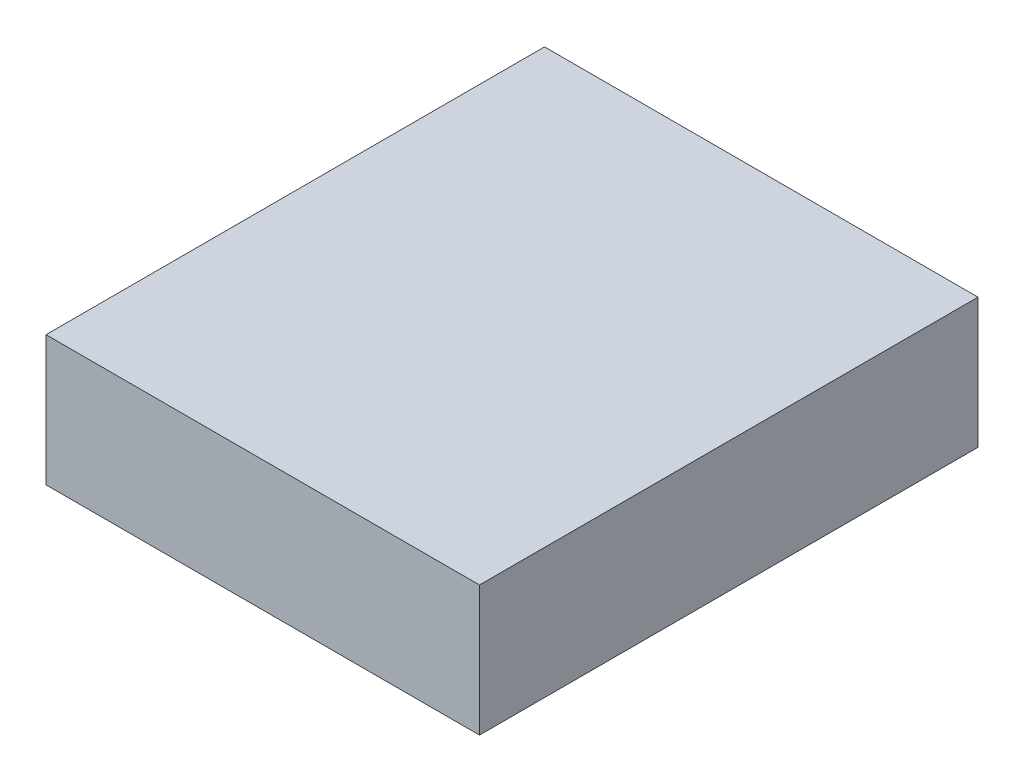
ISO-10303-21;
HEADER;
FILE_DESCRIPTION(('STEP AP214'),'2;1');
FILE_NAME('part.step','',(''),(''),'','','');
FILE_SCHEMA(('AUTOMOTIVE_DESIGN { 1 0 10303 214 1 1 1 1 }'));
ENDSEC;
DATA;
#1=APPLICATION_CONTEXT('core data for automotive mechanical design processes');
#2=APPLICATION_PROTOCOL_DEFINITION('international standard','automotive_design',2000,#1);
#3=PRODUCT_CONTEXT('',#1,'mechanical');
#4=PRODUCT('Part','Part','',(#3));
#5=PRODUCT_RELATED_PRODUCT_CATEGORY('part','',(#4));
#6=PRODUCT_DEFINITION_FORMATION('','',#4);
#7=PRODUCT_DEFINITION_CONTEXT('part definition',#1,'design');
#8=PRODUCT_DEFINITION('design','',#6,#7);
#9=PRODUCT_DEFINITION_SHAPE('','',#8);
#10=(LENGTH_UNIT() NAMED_UNIT(*) SI_UNIT(.MILLI.,.METRE.));
#11=(NAMED_UNIT(*) PLANE_ANGLE_UNIT() SI_UNIT($,.RADIAN.));
#12=(NAMED_UNIT(*) SI_UNIT($,.STERADIAN.) SOLID_ANGLE_UNIT());
#13=UNCERTAINTY_MEASURE_WITH_UNIT(LENGTH_MEASURE(1.E-05),#10,'distance_accuracy_value','');
#14=(GEOMETRIC_REPRESENTATION_CONTEXT(3) GLOBAL_UNCERTAINTY_ASSIGNED_CONTEXT((#13)) GLOBAL_UNIT_ASSIGNED_CONTEXT((#10,
#11,#12)) REPRESENTATION_CONTEXT('',''));
#15=CARTESIAN_POINT('',(0.,0.,0.));
#16=DIRECTION('',(0.,0.,1.));
#17=DIRECTION('',(1.,0.,0.));
#18=AXIS2_PLACEMENT_3D('',#15,#16,#17);
#19=CARTESIAN_POINT('',(-63.5,38.1,73.025));
#20=DIRECTION('',(1.,0.,0.));
#21=DIRECTION('',(0.,0.,-1.));
#22=AXIS2_PLACEMENT_3D('',#19,#20,#21);
#23=PLANE('',#22);
#24=DIRECTION('',(0.,0.,1.));
#25=VECTOR('',#24,1.);
#26=CARTESIAN_POINT('',(-63.5,0.,73.025));
#27=LINE('',#26,#25);
#28=CARTESIAN_POINT('',(-63.5,0.,-73.025));
#29=VERTEX_POINT('',#28);
#30=CARTESIAN_POINT('',(-63.5,0.,73.025));
#31=VERTEX_POINT('',#30);
#32=EDGE_CURVE('E97',#29,#31,#27,.T.);
#33=ORIENTED_EDGE('',*,*,#32,.T.);
#34=DIRECTION('',(0.,-1.,0.));
#35=VECTOR('',#34,1.);
#36=CARTESIAN_POINT('',(-63.5,38.1,73.025));
#37=LINE('',#36,#35);
#38=CARTESIAN_POINT('',(-63.5,38.1,73.025));
#39=VERTEX_POINT('',#38);
#40=EDGE_CURVE('E11',#39,#31,#37,.T.);
#41=ORIENTED_EDGE('',*,*,#40,.F.);
#42=DIRECTION('',(0.,0.,1.));
#43=VECTOR('',#42,1.);
#44=CARTESIAN_POINT('',(-63.5,38.1,73.025));
#45=LINE('',#44,#43);
#46=CARTESIAN_POINT('',(-63.5,38.1,-73.025));
#47=VERTEX_POINT('',#46);
#48=EDGE_CURVE('E85',#47,#39,#45,.T.);
#49=ORIENTED_EDGE('',*,*,#48,.F.);
#50=DIRECTION('',(0.,-1.,0.));
#51=VECTOR('',#50,1.);
#52=CARTESIAN_POINT('',(-63.5,38.1,-73.025));
#53=LINE('',#52,#51);
#54=EDGE_CURVE('E93',#47,#29,#53,.T.);
#55=ORIENTED_EDGE('',*,*,#54,.T.);
#56=EDGE_LOOP('',(#33,#41,#49,#55));
#57=FACE_BOUND('',#56,.T.);
#58=ADVANCED_FACE('F34',(#57),#23,.F.);
#59=CARTESIAN_POINT('',(63.5,38.1,73.025));
#60=DIRECTION('',(0.,0.,-1.));
#61=DIRECTION('',(-1.,0.,0.));
#62=AXIS2_PLACEMENT_3D('',#59,#60,#61);
#63=PLANE('',#62);
#64=DIRECTION('',(1.,0.,0.));
#65=VECTOR('',#64,1.);
#66=CARTESIAN_POINT('',(63.5,0.,73.025));
#67=LINE('',#66,#65);
#68=CARTESIAN_POINT('',(63.5,0.,73.025));
#69=VERTEX_POINT('',#68);
#70=EDGE_CURVE('E89',#31,#69,#67,.T.);
#71=ORIENTED_EDGE('',*,*,#70,.T.);
#72=DIRECTION('',(0.,-1.,0.));
#73=VECTOR('',#72,1.);
#74=CARTESIAN_POINT('',(63.5,38.1,73.025));
#75=LINE('',#74,#73);
#76=CARTESIAN_POINT('',(63.5,38.1,73.025));
#77=VERTEX_POINT('',#76);
#78=EDGE_CURVE('E42',#77,#69,#75,.T.);
#79=ORIENTED_EDGE('',*,*,#78,.F.);
#80=DIRECTION('',(1.,0.,0.));
#81=VECTOR('',#80,1.);
#82=CARTESIAN_POINT('',(63.5,38.1,73.025));
#83=LINE('',#82,#81);
#84=EDGE_CURVE('E80',#39,#77,#83,.T.);
#85=ORIENTED_EDGE('',*,*,#84,.F.);
#86=ORIENTED_EDGE('',*,*,#40,.T.);
#87=EDGE_LOOP('',(#71,#79,#85,#86));
#88=FACE_BOUND('',#87,.T.);
#89=ADVANCED_FACE('F88',(#88),#63,.F.);
#90=CARTESIAN_POINT('',(63.5,38.1,73.025));
#91=DIRECTION('',(-1.,0.,0.));
#92=DIRECTION('',(0.,0.,1.));
#93=AXIS2_PLACEMENT_3D('',#90,#91,#92);
#94=PLANE('',#93);
#95=DIRECTION('',(0.,0.,-1.));
#96=VECTOR('',#95,1.);
#97=CARTESIAN_POINT('',(63.5,0.,73.025));
#98=LINE('',#97,#96);
#99=CARTESIAN_POINT('',(63.5,0.,-73.025));
#100=VERTEX_POINT('',#99);
#101=EDGE_CURVE('E67',#69,#100,#98,.T.);
#102=ORIENTED_EDGE('',*,*,#101,.T.);
#103=DIRECTION('',(0.,-1.,0.));
#104=VECTOR('',#103,1.);
#105=CARTESIAN_POINT('',(63.5,38.1,-73.025));
#106=LINE('',#105,#104);
#107=CARTESIAN_POINT('',(63.5,38.1,-73.025));
#108=VERTEX_POINT('',#107);
#109=EDGE_CURVE('E90',#108,#100,#106,.T.);
#110=ORIENTED_EDGE('',*,*,#109,.F.);
#111=DIRECTION('',(0.,0.,-1.));
#112=VECTOR('',#111,1.);
#113=CARTESIAN_POINT('',(63.5,38.1,73.025));
#114=LINE('',#113,#112);
#115=EDGE_CURVE('E83',#77,#108,#114,.T.);
#116=ORIENTED_EDGE('',*,*,#115,.F.);
#117=ORIENTED_EDGE('',*,*,#78,.T.);
#118=EDGE_LOOP('',(#102,#110,#116,#117));
#119=FACE_BOUND('',#118,.T.);
#120=ADVANCED_FACE('F91',(#119),#94,.F.);
#121=CARTESIAN_POINT('',(63.5,38.1,-73.025));
#122=DIRECTION('',(0.,0.,1.));
#123=DIRECTION('',(1.,0.,0.));
#124=AXIS2_PLACEMENT_3D('',#121,#122,#123);
#125=PLANE('',#124);
#126=DIRECTION('',(-1.,0.,0.));
#127=VECTOR('',#126,1.);
#128=CARTESIAN_POINT('',(63.5,0.,-73.025));
#129=LINE('',#128,#127);
#130=EDGE_CURVE('E73',#100,#29,#129,.T.);
#131=ORIENTED_EDGE('',*,*,#130,.T.);
#132=ORIENTED_EDGE('',*,*,#54,.F.);
#133=DIRECTION('',(-1.,0.,0.));
#134=VECTOR('',#133,1.);
#135=CARTESIAN_POINT('',(63.5,38.1,-73.025));
#136=LINE('',#135,#134);
#137=EDGE_CURVE('E50',#108,#47,#136,.T.);
#138=ORIENTED_EDGE('',*,*,#137,.F.);
#139=ORIENTED_EDGE('',*,*,#109,.T.);
#140=EDGE_LOOP('',(#131,#132,#138,#139));
#141=FACE_BOUND('',#140,.T.);
#142=ADVANCED_FACE('F104',(#141),#125,.F.);
#143=CARTESIAN_POINT('',(0.,38.1,0.));
#144=DIRECTION('',(0.,1.,0.));
#145=DIRECTION('',(0.,0.,1.));
#146=AXIS2_PLACEMENT_3D('',#143,#144,#145);
#147=PLANE('',#146);
#148=ORIENTED_EDGE('',*,*,#48,.T.);
#149=ORIENTED_EDGE('',*,*,#84,.T.);
#150=ORIENTED_EDGE('',*,*,#115,.T.);
#151=ORIENTED_EDGE('',*,*,#137,.T.);
#152=EDGE_LOOP('',(#148,#149,#150,#151));
#153=FACE_BOUND('',#152,.T.);
#154=ADVANCED_FACE('F81',(#153),#147,.T.);
#155=CARTESIAN_POINT('',(0.,0.,0.));
#156=DIRECTION('',(0.,1.,0.));
#157=DIRECTION('',(0.,0.,1.));
#158=AXIS2_PLACEMENT_3D('',#155,#156,#157);
#159=PLANE('',#158);
#160=ORIENTED_EDGE('',*,*,#32,.F.);
#161=ORIENTED_EDGE('',*,*,#130,.F.);
#162=ORIENTED_EDGE('',*,*,#101,.F.);
#163=ORIENTED_EDGE('',*,*,#70,.F.);
#164=EDGE_LOOP('',(#160,#161,#162,#163));
#165=FACE_BOUND('',#164,.T.);
#166=ADVANCED_FACE('F107',(#165),#159,.F.);
#167=CLOSED_SHELL('',(#58,#89,#120,#142,#154,#166));
#168=MANIFOLD_SOLID_BREP('B2',#167);
#169=ADVANCED_BREP_SHAPE_REPRESENTATION('',(#18,#168),#14);
#170=SHAPE_DEFINITION_REPRESENTATION(#9,#169);
ENDSEC;
END-ISO-10303-21;
